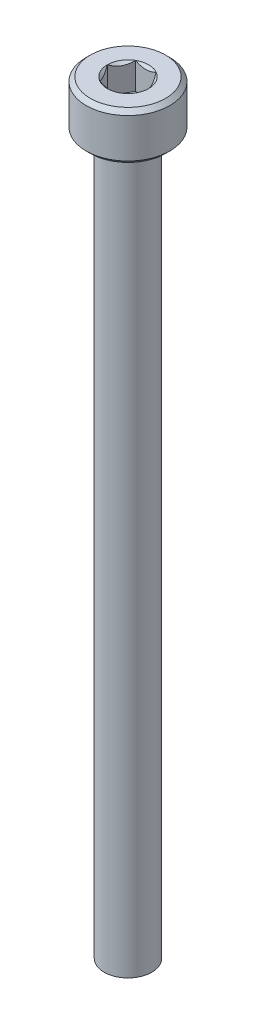
ISO-10303-21;
HEADER;
FILE_DESCRIPTION(('STEP AP214'),'2;1');
FILE_NAME('part.step','',(''),(''),'','','');
FILE_SCHEMA(('AUTOMOTIVE_DESIGN { 1 0 10303 214 1 1 1 1 }'));
ENDSEC;
DATA;
#1=APPLICATION_CONTEXT('core data for automotive mechanical design processes');
#2=APPLICATION_PROTOCOL_DEFINITION('international standard','automotive_design',2000,#1);
#3=PRODUCT_CONTEXT('',#1,'mechanical');
#4=PRODUCT('Part','Part','',(#3));
#5=PRODUCT_RELATED_PRODUCT_CATEGORY('part','',(#4));
#6=PRODUCT_DEFINITION_FORMATION('','',#4);
#7=PRODUCT_DEFINITION_CONTEXT('part definition',#1,'design');
#8=PRODUCT_DEFINITION('design','',#6,#7);
#9=PRODUCT_DEFINITION_SHAPE('','',#8);
#10=(LENGTH_UNIT() NAMED_UNIT(*) SI_UNIT(.MILLI.,.METRE.));
#11=(NAMED_UNIT(*) PLANE_ANGLE_UNIT() SI_UNIT($,.RADIAN.));
#12=(NAMED_UNIT(*) SI_UNIT($,.STERADIAN.) SOLID_ANGLE_UNIT());
#13=UNCERTAINTY_MEASURE_WITH_UNIT(LENGTH_MEASURE(1.E-05),#10,'distance_accuracy_value','');
#14=(GEOMETRIC_REPRESENTATION_CONTEXT(3) GLOBAL_UNCERTAINTY_ASSIGNED_CONTEXT((#13)) GLOBAL_UNIT_ASSIGNED_CONTEXT((#10,
#11,#12)) REPRESENTATION_CONTEXT('',''));
#15=CARTESIAN_POINT('',(0.,0.,0.));
#16=DIRECTION('',(0.,0.,1.));
#17=DIRECTION('',(1.,0.,0.));
#18=AXIS2_PLACEMENT_3D('',#15,#16,#17);
#19=CARTESIAN_POINT('',(0.,4.,0.));
#20=DIRECTION('',(0.,-1.,0.));
#21=DIRECTION('',(0.,0.,-1.));
#22=AXIS2_PLACEMENT_3D('',#19,#20,#21);
#23=CYLINDRICAL_SURFACE('',#22,3.5);
#24=CARTESIAN_POINT('',(0.,0.350000000000001,0.));
#25=DIRECTION('',(0.,1.,0.));
#26=DIRECTION('',(0.,0.,1.));
#27=AXIS2_PLACEMENT_3D('',#24,#25,#26);
#28=CIRCLE('',#27,3.5);
#29=CARTESIAN_POINT('',(0.,0.350000000000001,3.5));
#30=VERTEX_POINT('',#29);
#31=EDGE_CURVE('E222',#30,#30,#28,.T.);
#32=ORIENTED_EDGE('',*,*,#31,.T.);
#33=EDGE_LOOP('',(#32));
#34=FACE_BOUND('',#33,.T.);
#35=CARTESIAN_POINT('',(0.,3.65,0.));
#36=DIRECTION('',(0.,1.,0.));
#37=DIRECTION('',(0.,0.,1.));
#38=AXIS2_PLACEMENT_3D('',#35,#36,#37);
#39=CIRCLE('',#38,3.5);
#40=CARTESIAN_POINT('',(0.,3.65,3.5));
#41=VERTEX_POINT('',#40);
#42=EDGE_CURVE('E105',#41,#41,#39,.F.);
#43=ORIENTED_EDGE('',*,*,#42,.T.);
#44=EDGE_LOOP('',(#43));
#45=FACE_BOUND('',#44,.T.);
#46=ADVANCED_FACE('F33',(#34,#45),#23,.T.);
#47=CARTESIAN_POINT('',(0.,4.,0.));
#48=DIRECTION('',(0.,1.,0.));
#49=DIRECTION('',(0.,0.,1.));
#50=AXIS2_PLACEMENT_3D('',#47,#48,#49);
#51=PLANE('',#50);
#52=CARTESIAN_POINT('',(0.,4.,0.));
#53=DIRECTION('',(0.,1.,0.));
#54=DIRECTION('',(0.,0.,1.));
#55=AXIS2_PLACEMENT_3D('',#52,#53,#54);
#56=CIRCLE('',#55,3.15);
#57=CARTESIAN_POINT('',(0.,4.,3.15));
#58=VERTEX_POINT('',#57);
#59=EDGE_CURVE('E37',#58,#58,#56,.T.);
#60=ORIENTED_EDGE('',*,*,#59,.T.);
#61=EDGE_LOOP('',(#60));
#62=FACE_BOUND('',#61,.T.);
#63=CARTESIAN_POINT('',(0.,4.,0.));
#64=DIRECTION('',(0.,1.,0.));
#65=DIRECTION('',(0.,0.,1.));
#66=AXIS2_PLACEMENT_3D('',#63,#64,#65);
#67=CIRCLE('',#66,1.73205080756888);
#68=CARTESIAN_POINT('',(0.866025403784438,4.,1.5));
#69=VERTEX_POINT('',#68);
#70=CARTESIAN_POINT('',(1.73205080756888,4.,0.));
#71=VERTEX_POINT('',#70);
#72=EDGE_CURVE('E48',#69,#71,#67,.T.);
#73=ORIENTED_EDGE('',*,*,#72,.F.);
#74=CARTESIAN_POINT('',(-0.866025403784438,4.,1.5));
#75=VERTEX_POINT('',#74);
#76=EDGE_CURVE('E55',#75,#69,#67,.T.);
#77=ORIENTED_EDGE('',*,*,#76,.F.);
#78=CARTESIAN_POINT('',(-1.73205080756888,4.,0.));
#79=VERTEX_POINT('',#78);
#80=EDGE_CURVE('E128',#79,#75,#67,.T.);
#81=ORIENTED_EDGE('',*,*,#80,.F.);
#82=CARTESIAN_POINT('',(-0.866025403784439,4.,-1.5));
#83=VERTEX_POINT('',#82);
#84=EDGE_CURVE('E127',#83,#79,#67,.T.);
#85=ORIENTED_EDGE('',*,*,#84,.F.);
#86=CARTESIAN_POINT('',(0.866025403784438,4.,-1.5));
#87=VERTEX_POINT('',#86);
#88=EDGE_CURVE('E95',#87,#83,#67,.T.);
#89=ORIENTED_EDGE('',*,*,#88,.F.);
#90=EDGE_CURVE('E87',#71,#87,#67,.T.);
#91=ORIENTED_EDGE('',*,*,#90,.F.);
#92=EDGE_LOOP('',(#73,#77,#81,#85,#89,#91));
#93=FACE_BOUND('',#92,.T.);
#94=ADVANCED_FACE('F125',(#62,#93),#51,.T.);
#95=CARTESIAN_POINT('',(0.,0.,0.));
#96=DIRECTION('',(0.,1.,0.));
#97=DIRECTION('',(0.,0.,1.));
#98=AXIS2_PLACEMENT_3D('',#95,#96,#97);
#99=PLANE('',#98);
#100=CARTESIAN_POINT('',(0.,0.,0.));
#101=DIRECTION('',(0.,-1.,0.));
#102=DIRECTION('',(0.,0.,-1.));
#103=AXIS2_PLACEMENT_3D('',#100,#101,#102);
#104=CIRCLE('',#103,2.);
#105=CARTESIAN_POINT('',(0.,0.,-2.));
#106=VERTEX_POINT('',#105);
#107=EDGE_CURVE('E11',#106,#106,#104,.T.);
#108=ORIENTED_EDGE('',*,*,#107,.F.);
#109=EDGE_LOOP('',(#108));
#110=FACE_BOUND('',#109,.T.);
#111=CARTESIAN_POINT('',(0.,0.,0.));
#112=DIRECTION('',(0.,1.,0.));
#113=DIRECTION('',(0.,0.,1.));
#114=AXIS2_PLACEMENT_3D('',#111,#112,#113);
#115=CIRCLE('',#114,3.15);
#116=CARTESIAN_POINT('',(0.,0.,3.15));
#117=VERTEX_POINT('',#116);
#118=EDGE_CURVE('E220',#117,#117,#115,.F.);
#119=ORIENTED_EDGE('',*,*,#118,.T.);
#120=EDGE_LOOP('',(#119));
#121=FACE_BOUND('',#120,.T.);
#122=ADVANCED_FACE('F203',(#110,#121),#99,.F.);
#123=CARTESIAN_POINT('',(0.,4.,0.));
#124=DIRECTION('',(0.,1.,0.));
#125=DIRECTION('',(0.,0.,1.));
#126=AXIS2_PLACEMENT_3D('',#123,#124,#125);
#127=CONICAL_SURFACE('',#126,1.73205080756888,0.78539816339745);
#128=ORIENTED_EDGE('',*,*,#88,.T.);
#129=CARTESIAN_POINT('',(-1.72720812969692,4.55557851627079,-1.5));
#130=CARTESIAN_POINT('',(-1.68515175699268,4.52382990785743,-1.5));
#131=CARTESIAN_POINT('',(-1.64286104748673,4.49239259380738,-1.5));
#132=CARTESIAN_POINT('',(-1.55771581035942,4.43026908755641,-1.5));
#133=CARTESIAN_POINT('',(-1.51486114386668,4.3995830858922,-1.5));
#134=CARTESIAN_POINT('',(-1.3846813415127,4.30840719242716,-1.5));
#135=CARTESIAN_POINT('',(-1.29637976071654,4.24928834342677,-1.5));
#136=CARTESIAN_POINT('',(-1.11121478730467,4.1332309963165,-1.5));
#137=CARTESIAN_POINT('',(-1.01415038238167,4.07660955873301,-1.5));
#138=CARTESIAN_POINT('',(-0.815173408897606,3.97303688126565,-1.5));
#139=CARTESIAN_POINT('',(-0.713278669253285,3.92605304154167,-1.5));
#140=CARTESIAN_POINT('',(-0.560333774943112,3.86857266843083,-1.5));
#141=CARTESIAN_POINT('',(-0.511547982948042,3.85207538775725,-1.5));
#142=CARTESIAN_POINT('',(-0.412798620136866,3.822997512927,-1.5));
#143=CARTESIAN_POINT('',(-0.362834968437563,3.81041718859402,-1.5));
#144=CARTESIAN_POINT('',(-0.262863235444982,3.79003619414677,-1.5));
#145=CARTESIAN_POINT('',(-0.212872113808023,3.78215363274598,-1.5));
#146=CARTESIAN_POINT('',(-0.112355243569545,3.771322063969,-1.5));
#147=CARTESIAN_POINT('',(-0.0618295883726279,3.76837220852435,-1.5));
#148=CARTESIAN_POINT('',(0.037429173332384,3.76762485772485,-1.5));
#149=CARTESIAN_POINT('',(0.0861609672002989,3.76964473355808,-1.5));
#150=CARTESIAN_POINT('',(0.183206937768827,3.77832255289676,-1.5));
#151=CARTESIAN_POINT('',(0.231521073438269,3.78498094696846,-1.5));
#152=CARTESIAN_POINT('',(0.328199853425436,3.80268524412257,-1.5));
#153=CARTESIAN_POINT('',(0.376550616310328,3.81380581125704,-1.5));
#154=CARTESIAN_POINT('',(0.472195697125598,3.83984341404871,-1.5));
#155=CARTESIAN_POINT('',(0.51949010309274,3.85476013204094,-1.5));
#156=CARTESIAN_POINT('',(0.668391282696624,3.90733522359607,-1.5));
#157=CARTESIAN_POINT('',(0.767878709508552,3.95098128747198,-1.5));
#158=CARTESIAN_POINT('',(0.962179866690724,4.0480229945931,-1.5));
#159=CARTESIAN_POINT('',(1.05697519961444,4.10145366508953,-1.5));
#160=CARTESIAN_POINT('',(1.23814273533383,4.21168585200456,-1.5));
#161=CARTESIAN_POINT('',(1.3246994218129,4.2681879206986,-1.5));
#162=CARTESIAN_POINT('',(1.45222331290673,4.35553430157866,-1.5));
#163=CARTESIAN_POINT('',(1.49418091978756,4.38495775868004,-1.5));
#164=CARTESIAN_POINT('',(1.57752272931476,4.44458282183046,-1.5));
#165=CARTESIAN_POINT('',(1.61890708647354,4.47478421166444,-1.5));
#166=CARTESIAN_POINT('',(1.66005278019494,4.50530817860946,-1.5));
#167=B_SPLINE_CURVE_WITH_KNOTS('',3,(#129,#130,#131,#132,#133,#134,#135,#136,#137,#138,#139,
#140,#141,#142,#143,#144,#145,#146,#147,#148,#149,#150,#151,#152,#153,#154,#155,#156,#157,#158,
#159,#160,#161,#162,#163,#164,#165,#166),.UNSPECIFIED.,.F.,.F.,(4,2,2,2,2,2,2,2,2,2,2,2,2,2,2,2,
2,2,4),(0.,0.158079548982669,0.316198780993942,0.634850417346958,0.971690311361509,
1.30737131660667,1.46173961127089,1.61611853740677,1.76772101421409,1.91929742368538,
2.065387412096,2.21149159305544,2.36014984633872,2.50879566386709,2.83376031422673,
3.15991186985652,3.46985601802197,3.62358896039974,3.7772796264207),.UNSPECIFIED.);
#168=EDGE_CURVE('E100',#87,#83,#167,.F.);
#169=ORIENTED_EDGE('',*,*,#168,.F.);
#170=EDGE_LOOP('',(#128,#169));
#171=FACE_BOUND('',#170,.T.);
#172=ADVANCED_FACE('F101',(#171),#127,.F.);
#173=ORIENTED_EDGE('',*,*,#84,.T.);
#174=CARTESIAN_POINT('',(-0.865909933730601,4.00011548160007,-1.5002));
#175=CARTESIAN_POINT('',(-0.895682611594166,3.97036547606733,-1.44863220926292));
#176=CARTESIAN_POINT('',(-0.925953159489765,3.94236248391031,-1.3962020823348));
#177=CARTESIAN_POINT('',(-0.987678321317123,3.89108923044014,-1.2892909659444));
#178=CARTESIAN_POINT('',(-1.01913880822717,3.86784750504437,-1.23479980418534));
#179=CARTESIAN_POINT('',(-1.08257741237344,3.82803372899222,-1.12492091864275));
#180=CARTESIAN_POINT('',(-1.11453936608521,3.8113615856709,-1.0695611909048));
#181=CARTESIAN_POINT('',(-1.1791670593912,3.7856744568181,-0.957622742522849));
#182=CARTESIAN_POINT('',(-1.21183082354213,3.77664029047887,-0.901047443446992));
#183=CARTESIAN_POINT('',(-1.26812411040032,3.76848908122685,-0.803544610483559));
#184=CARTESIAN_POINT('',(-1.29168087824208,3.76728225298922,-0.762743091719534));
#185=CARTESIAN_POINT('',(-1.33875285845138,3.76931405716227,-0.681212030384142));
#186=CARTESIAN_POINT('',(-1.36226806050018,3.77255367074831,-0.64048250568537));
#187=CARTESIAN_POINT('',(-1.40907206156905,3.78329198598196,-0.559415597836584));
#188=CARTESIAN_POINT('',(-1.43236062923612,3.79079465301873,-0.519078615401712));
#189=CARTESIAN_POINT('',(-1.47854689118996,3.80965161192829,-0.439081663085969));
#190=CARTESIAN_POINT('',(-1.50144441326545,3.82100755701858,-0.399421991483792));
#191=CARTESIAN_POINT('',(-1.56009461325633,3.85472164759267,-0.297836865225515));
#192=CARTESIAN_POINT('',(-1.59548353987866,3.87962184909337,-0.236541446290311));
#193=CARTESIAN_POINT('',(-1.64751843074894,3.92165665327158,-0.146414371536686));
#194=CARTESIAN_POINT('',(-1.66466545167617,3.9364251535591,-0.116714860092282));
#195=CARTESIAN_POINT('',(-1.69864410935691,3.96731056594017,-0.0578620986162487));
#196=CARTESIAN_POINT('',(-1.71547589206761,3.98342683412171,-0.0287085957793624));
#197=CARTESIAN_POINT('',(-1.73216627762272,4.00011548160007,0.00020000000000028));
#198=B_SPLINE_CURVE_WITH_KNOTS('',3,(#174,#175,#176,#177,#178,#179,#180,#181,#182,#183,#184,
#185,#186,#187,#188,#189,#190,#191,#192,#193,#194,#195,#196,#197),.UNSPECIFIED.,.F.,.F.,(4,2,2,
2,2,2,2,2,2,2,2,4),(0.,0.199829143693304,0.400822987382388,0.598623720538181,0.795926240188889,
0.937113067959881,1.07833105577193,1.21968061668222,1.36109089931054,1.58570969637565,
1.69770705470964,1.80965120737194),.UNSPECIFIED.);
#199=EDGE_CURVE('E130',#83,#79,#198,.T.);
#200=ORIENTED_EDGE('',*,*,#199,.F.);
#201=EDGE_LOOP('',(#173,#200));
#202=FACE_BOUND('',#201,.T.);
#203=ADVANCED_FACE('F237',(#202),#127,.F.);
#204=ORIENTED_EDGE('',*,*,#80,.T.);
#205=CARTESIAN_POINT('',(-1.73216627762272,4.00011548160007,-0.000199999999999694));
#206=CARTESIAN_POINT('',(-1.70239359975915,3.97036547606733,0.051367790737076));
#207=CARTESIAN_POINT('',(-1.67212305186355,3.94236248391031,0.103797917665201));
#208=CARTESIAN_POINT('',(-1.61039789003619,3.89108923044014,0.210709034055597));
#209=CARTESIAN_POINT('',(-1.57893740312614,3.86784750504437,0.265200195814662));
#210=CARTESIAN_POINT('',(-1.51549879897987,3.82803372899222,0.375079081357249));
#211=CARTESIAN_POINT('',(-1.4835368452681,3.8113615856709,0.4304388090952));
#212=CARTESIAN_POINT('',(-1.41890915196211,3.7856744568181,0.542377257477151));
#213=CARTESIAN_POINT('',(-1.38624538781118,3.77664029047887,0.598952556553009));
#214=CARTESIAN_POINT('',(-1.32995210095299,3.76848908122685,0.696455389516441));
#215=CARTESIAN_POINT('',(-1.30639533311124,3.76728225298922,0.737256908280466));
#216=CARTESIAN_POINT('',(-1.25932335290193,3.76931405716227,0.818787969615858));
#217=CARTESIAN_POINT('',(-1.23580815085313,3.77255367074831,0.85951749431463));
#218=CARTESIAN_POINT('',(-1.18900414978427,3.78329198598196,0.940584402163416));
#219=CARTESIAN_POINT('',(-1.1657155821172,3.79079465301873,0.980921384598288));
#220=CARTESIAN_POINT('',(-1.11952932016335,3.80965161192829,1.06091833691403));
#221=CARTESIAN_POINT('',(-1.09663179808786,3.82100755701859,1.10057800851621));
#222=CARTESIAN_POINT('',(-1.03798159809698,3.85472164759267,1.20216313477448));
#223=CARTESIAN_POINT('',(-1.00259267147465,3.87962184909337,1.26345855370969));
#224=CARTESIAN_POINT('',(-0.950557780604375,3.92165665327158,1.35358562846331));
#225=CARTESIAN_POINT('',(-0.933410759677147,3.9364251535591,1.38328513990772));
#226=CARTESIAN_POINT('',(-0.899432101996407,3.96731056594017,1.44213790138375));
#227=CARTESIAN_POINT('',(-0.88260031928571,3.98342683412171,1.47129140422064));
#228=CARTESIAN_POINT('',(-0.865909933730601,4.00011548160007,1.5002));
#229=B_SPLINE_CURVE_WITH_KNOTS('',3,(#205,#206,#207,#208,#209,#210,#211,#212,#213,#214,#215,
#216,#217,#218,#219,#220,#221,#222,#223,#224,#225,#226,#227,#228),.UNSPECIFIED.,.F.,.F.,(4,2,2,
2,2,2,2,2,2,2,2,4),(0.,0.199829143693305,0.400822987382389,0.598623720538181,0.795926240188889,
0.937113067959881,1.07833105577193,1.21968061668222,1.36109089931054,1.58570969637565,
1.69770705470964,1.80965120737194),.UNSPECIFIED.);
#230=EDGE_CURVE('E139',#79,#75,#229,.T.);
#231=ORIENTED_EDGE('',*,*,#230,.F.);
#232=EDGE_LOOP('',(#204,#231));
#233=FACE_BOUND('',#232,.T.);
#234=ADVANCED_FACE('F252',(#233),#127,.F.);
#235=ORIENTED_EDGE('',*,*,#76,.T.);
#236=CARTESIAN_POINT('',(-1.72720812994822,4.55557851646053,1.5));
#237=CARTESIAN_POINT('',(-1.68515175723693,4.52382990803985,1.5));
#238=CARTESIAN_POINT('',(-1.64286104772391,4.49239259398251,1.5));
#239=CARTESIAN_POINT('',(-1.55771581058238,4.43026908771699,1.5));
#240=CARTESIAN_POINT('',(-1.51486114408249,4.39958308604553,1.5));
#241=CARTESIAN_POINT('',(-1.38468134170665,4.30840719255859,1.5));
#242=CARTESIAN_POINT('',(-1.29637976089561,4.24928834354366,1.5));
#243=CARTESIAN_POINT('',(-1.11121478745132,4.13323099640349,1.5));
#244=CARTESIAN_POINT('',(-1.01415038251067,4.07660955880473,1.5));
#245=CARTESIAN_POINT('',(-0.815173408989814,3.9730368813091,1.5));
#246=CARTESIAN_POINT('',(-0.71327866932636,3.92605304157206,1.5));
#247=CARTESIAN_POINT('',(-0.56033377500179,3.86857266845154,1.5));
#248=CARTESIAN_POINT('',(-0.511547983012749,3.85207538777834,1.5));
#249=CARTESIAN_POINT('',(-0.412798620213828,3.82299751294763,1.5));
#250=CARTESIAN_POINT('',(-0.362834968520751,3.8104171886138,1.5));
#251=CARTESIAN_POINT('',(-0.262863235540417,3.79003619416346,1.5));
#252=CARTESIAN_POINT('',(-0.212872113909475,3.78215363276045,1.5));
#253=CARTESIAN_POINT('',(-0.112355243682832,3.77132206397768,1.5));
#254=CARTESIAN_POINT('',(-0.061829588491731,3.76837220852945,1.5));
#255=CARTESIAN_POINT('',(0.0374291732025493,3.76762485772178,1.5));
#256=CARTESIAN_POINT('',(0.086160967065534,3.76964473355048,1.5));
#257=CARTESIAN_POINT('',(0.183206937624695,3.77832255287941,1.5));
#258=CARTESIAN_POINT('',(0.2315210732897,3.78498094694588,1.5));
#259=CARTESIAN_POINT('',(0.328199853268108,3.80268524408904,1.5));
#260=CARTESIAN_POINT('',(0.376550616148692,3.81380581121775,1.5));
#261=CARTESIAN_POINT('',(0.47219569695576,3.83984341399777,1.5));
#262=CARTESIAN_POINT('',(0.51949010291901,3.8547601319841,1.5));
#263=CARTESIAN_POINT('',(0.668391282485064,3.90733522351148,1.5));
#264=CARTESIAN_POINT('',(0.767878709264951,3.95098128736184,1.5));
#265=CARTESIAN_POINT('',(0.9621798663855,4.04802299442906,1.5));
#266=CARTESIAN_POINT('',(1.05697519927965,4.10145366489712,1.5));
#267=CARTESIAN_POINT('',(1.23814273494588,4.21168585175783,1.5));
#268=CARTESIAN_POINT('',(1.32469942140117,4.26818792042618,1.5));
#269=CARTESIAN_POINT('',(1.45222331245985,4.35553430126784,1.5));
#270=CARTESIAN_POINT('',(1.49418091932912,4.38495775835653,1.5));
#271=CARTESIAN_POINT('',(1.5775227288333,4.44458282148157,1.5));
#272=CARTESIAN_POINT('',(1.6189070859806,4.47478421130286,1.5));
#273=CARTESIAN_POINT('',(1.66005277969054,4.50530817823521,1.5));
#274=B_SPLINE_CURVE_WITH_KNOTS('',3,(#236,#237,#238,#239,#240,#241,#242,#243,#244,#245,#246,
#247,#248,#249,#250,#251,#252,#253,#254,#255,#256,#257,#258,#259,#260,#261,#262,#263,#264,#265,
#266,#267,#268,#269,#270,#271,#272,#273),.UNSPECIFIED.,.F.,.F.,(4,2,2,2,2,2,2,2,2,2,2,2,2,2,2,2,
2,2,4),(0.,0.158079549012757,0.316198781054129,0.634850417468465,0.971690311551782,
1.30737131686505,1.46173961151184,1.61611853763032,1.76772101442095,1.91929742387554,
2.06538741227089,2.21149159321503,2.36014984648185,2.50879566399376,2.83376031423511,
3.15991186974582,3.4698560178094,3.62358896013692,3.77727962610764),.UNSPECIFIED.);
#275=EDGE_CURVE('E166',#75,#69,#274,.T.);
#276=ORIENTED_EDGE('',*,*,#275,.F.);
#277=EDGE_LOOP('',(#235,#276));
#278=FACE_BOUND('',#277,.T.);
#279=ADVANCED_FACE('F282',(#278),#127,.F.);
#280=ORIENTED_EDGE('',*,*,#72,.T.);
#281=CARTESIAN_POINT('',(0.865909933730601,4.00011548160007,1.5002));
#282=CARTESIAN_POINT('',(0.895682611594166,3.97036547606733,1.44863220926292));
#283=CARTESIAN_POINT('',(0.925953159489765,3.94236248391031,1.3962020823348));
#284=CARTESIAN_POINT('',(0.987678321317124,3.89108923044014,1.2892909659444));
#285=CARTESIAN_POINT('',(1.01913880822717,3.86784750504437,1.23479980418534));
#286=CARTESIAN_POINT('',(1.08257741237344,3.82803372899222,1.12492091864275));
#287=CARTESIAN_POINT('',(1.11453936608521,3.8113615856709,1.0695611909048));
#288=CARTESIAN_POINT('',(1.1791670593912,3.7856744568181,0.95762274252285));
#289=CARTESIAN_POINT('',(1.21183082354213,3.77664029047887,0.901047443446992));
#290=CARTESIAN_POINT('',(1.26812411040032,3.76848908122685,0.80354461048356));
#291=CARTESIAN_POINT('',(1.29168087824208,3.76728225298922,0.762743091719534));
#292=CARTESIAN_POINT('',(1.33875285845138,3.76931405716227,0.681212030384142));
#293=CARTESIAN_POINT('',(1.36226806050018,3.77255367074831,0.640482505685371));
#294=CARTESIAN_POINT('',(1.40907206156905,3.78329198598196,0.559415597836584));
#295=CARTESIAN_POINT('',(1.43236062923612,3.79079465301873,0.519078615401712));
#296=CARTESIAN_POINT('',(1.47854689118996,3.80965161192829,0.43908166308597));
#297=CARTESIAN_POINT('',(1.50144441326545,3.82100755701859,0.399421991483792));
#298=CARTESIAN_POINT('',(1.56009461325633,3.85472164759267,0.297836865225515));
#299=CARTESIAN_POINT('',(1.59548353987866,3.87962184909337,0.236541446290311));
#300=CARTESIAN_POINT('',(1.64751843074894,3.92165665327158,0.146414371536686));
#301=CARTESIAN_POINT('',(1.66466545167617,3.9364251535591,0.116714860092282));
#302=CARTESIAN_POINT('',(1.69864410935691,3.96731056594017,0.0578620986162488));
#303=CARTESIAN_POINT('',(1.71547589206761,3.98342683412171,0.0287085957793626));
#304=CARTESIAN_POINT('',(1.73216627762272,4.00011548160007,-0.000200000000000026));
#305=B_SPLINE_CURVE_WITH_KNOTS('',3,(#281,#282,#283,#284,#285,#286,#287,#288,#289,#290,#291,
#292,#293,#294,#295,#296,#297,#298,#299,#300,#301,#302,#303,#304),.UNSPECIFIED.,.F.,.F.,(4,2,2,
2,2,2,2,2,2,2,2,4),(0.,0.199829143693305,0.400822987382389,0.59862372053818,0.795926240188889,
0.937113067959881,1.07833105577193,1.21968061668222,1.36109089931054,1.58570969637565,
1.69770705470964,1.80965120737194),.UNSPECIFIED.);
#306=EDGE_CURVE('E115',#69,#71,#305,.T.);
#307=ORIENTED_EDGE('',*,*,#306,.F.);
#308=EDGE_LOOP('',(#280,#307));
#309=FACE_BOUND('',#308,.T.);
#310=ADVANCED_FACE('F153',(#309),#127,.F.);
#311=ORIENTED_EDGE('',*,*,#90,.T.);
#312=CARTESIAN_POINT('',(1.73216627762272,4.00011548160007,0.000200000000000282));
#313=CARTESIAN_POINT('',(1.70239359975915,3.97036547606733,-0.0513677907370753));
#314=CARTESIAN_POINT('',(1.67212305186355,3.94236248391031,-0.103797917665201));
#315=CARTESIAN_POINT('',(1.61039789003619,3.89108923044014,-0.210709034055596));
#316=CARTESIAN_POINT('',(1.57893740312614,3.86784750504437,-0.265200195814661));
#317=CARTESIAN_POINT('',(1.51549879897987,3.82803372899222,-0.375079081357248));
#318=CARTESIAN_POINT('',(1.4835368452681,3.8113615856709,-0.430438809095199));
#319=CARTESIAN_POINT('',(1.41890915196211,3.7856744568181,-0.54237725747715));
#320=CARTESIAN_POINT('',(1.38624538781118,3.77664029047887,-0.598952556553008));
#321=CARTESIAN_POINT('',(1.32995210095299,3.76848908122685,-0.69645538951644));
#322=CARTESIAN_POINT('',(1.30639533311124,3.76728225298922,-0.737256908280466));
#323=CARTESIAN_POINT('',(1.25932335290193,3.76931405716227,-0.818787969615858));
#324=CARTESIAN_POINT('',(1.23580815085313,3.77255367074831,-0.85951749431463));
#325=CARTESIAN_POINT('',(1.18900414978427,3.78329198598196,-0.940584402163416));
#326=CARTESIAN_POINT('',(1.1657155821172,3.79079465301873,-0.980921384598288));
#327=CARTESIAN_POINT('',(1.11952932016335,3.80965161192829,-1.06091833691403));
#328=CARTESIAN_POINT('',(1.09663179808786,3.82100755701858,-1.10057800851621));
#329=CARTESIAN_POINT('',(1.03798159809698,3.85472164759267,-1.20216313477448));
#330=CARTESIAN_POINT('',(1.00259267147465,3.87962184909337,-1.26345855370969));
#331=CARTESIAN_POINT('',(0.950557780604375,3.92165665327158,-1.35358562846331));
#332=CARTESIAN_POINT('',(0.933410759677148,3.9364251535591,-1.38328513990772));
#333=CARTESIAN_POINT('',(0.899432101996407,3.96731056594017,-1.44213790138375));
#334=CARTESIAN_POINT('',(0.88260031928571,3.98342683412171,-1.47129140422064));
#335=CARTESIAN_POINT('',(0.865909933730601,4.00011548160007,-1.5002));
#336=B_SPLINE_CURVE_WITH_KNOTS('',3,(#312,#313,#314,#315,#316,#317,#318,#319,#320,#321,#322,
#323,#324,#325,#326,#327,#328,#329,#330,#331,#332,#333,#334,#335),.UNSPECIFIED.,.F.,.F.,(4,2,2,
2,2,2,2,2,2,2,2,4),(0.,0.199829143693305,0.400822987382389,0.598623720538181,0.79592624018889,
0.937113067959881,1.07833105577193,1.21968061668222,1.36109089931054,1.58570969637566,
1.69770705470964,1.80965120737194),.UNSPECIFIED.);
#337=EDGE_CURVE('E91',#71,#87,#336,.T.);
#338=ORIENTED_EDGE('',*,*,#337,.F.);
#339=EDGE_LOOP('',(#311,#338));
#340=FACE_BOUND('',#339,.T.);
#341=ADVANCED_FACE('F89',(#340),#127,.F.);
#342=CARTESIAN_POINT('',(0.,1.75,0.));
#343=DIRECTION('',(0.,1.,0.));
#344=DIRECTION('',(0.,0.,1.));
#345=AXIS2_PLACEMENT_3D('',#342,#343,#344);
#346=PLANE('',#345);
#347=DIRECTION('',(-0.5,0.,-0.866025403784439));
#348=VECTOR('',#347,1.);
#349=CARTESIAN_POINT('',(1.73205080756888,1.75,0.));
#350=LINE('',#349,#348);
#351=CARTESIAN_POINT('',(1.73205080756888,1.75,0.));
#352=VERTEX_POINT('',#351);
#353=CARTESIAN_POINT('',(0.866025403784438,1.75,-1.5));
#354=VERTEX_POINT('',#353);
#355=EDGE_CURVE('E114',#352,#354,#350,.T.);
#356=ORIENTED_EDGE('',*,*,#355,.T.);
#357=DIRECTION('',(-1.,0.,0.));
#358=VECTOR('',#357,1.);
#359=CARTESIAN_POINT('',(0.866025403784438,1.75,-1.5));
#360=LINE('',#359,#358);
#361=CARTESIAN_POINT('',(-0.866025403784439,1.75,-1.5));
#362=VERTEX_POINT('',#361);
#363=EDGE_CURVE('E119',#354,#362,#360,.T.);
#364=ORIENTED_EDGE('',*,*,#363,.T.);
#365=DIRECTION('',(-0.5,0.,0.866025403784439));
#366=VECTOR('',#365,1.);
#367=CARTESIAN_POINT('',(-0.866025403784439,1.75,-1.5));
#368=LINE('',#367,#366);
#369=CARTESIAN_POINT('',(-1.73205080756888,1.75,0.));
#370=VERTEX_POINT('',#369);
#371=EDGE_CURVE('E276',#362,#370,#368,.T.);
#372=ORIENTED_EDGE('',*,*,#371,.T.);
#373=DIRECTION('',(0.5,0.,0.866025403784439));
#374=VECTOR('',#373,1.);
#375=CARTESIAN_POINT('',(-1.73205080756888,1.75,0.));
#376=LINE('',#375,#374);
#377=CARTESIAN_POINT('',(-0.866025403784438,1.75,1.5));
#378=VERTEX_POINT('',#377);
#379=EDGE_CURVE('E259',#370,#378,#376,.T.);
#380=ORIENTED_EDGE('',*,*,#379,.T.);
#381=DIRECTION('',(1.,0.,0.));
#382=VECTOR('',#381,1.);
#383=CARTESIAN_POINT('',(-0.866025403784438,1.75,1.5));
#384=LINE('',#383,#382);
#385=CARTESIAN_POINT('',(0.866025403784439,1.75,1.5));
#386=VERTEX_POINT('',#385);
#387=EDGE_CURVE('E272',#378,#386,#384,.T.);
#388=ORIENTED_EDGE('',*,*,#387,.T.);
#389=DIRECTION('',(0.5,0.,-0.866025403784439));
#390=VECTOR('',#389,1.);
#391=CARTESIAN_POINT('',(0.866025403784439,1.75,1.5));
#392=LINE('',#391,#390);
#393=EDGE_CURVE('E122',#386,#352,#392,.T.);
#394=ORIENTED_EDGE('',*,*,#393,.T.);
#395=EDGE_LOOP('',(#356,#364,#372,#380,#388,#394));
#396=FACE_BOUND('',#395,.T.);
#397=ADVANCED_FACE('F152',(#396),#346,.T.);
#398=CARTESIAN_POINT('',(0.866025403784438,1.75,-1.5));
#399=DIRECTION('',(0.,0.,-1.));
#400=DIRECTION('',(-1.,0.,0.));
#401=AXIS2_PLACEMENT_3D('',#398,#399,#400);
#402=PLANE('',#401);
#403=DIRECTION('',(0.,1.,0.));
#404=VECTOR('',#403,1.);
#405=CARTESIAN_POINT('',(0.866025403784438,1.75,-1.5));
#406=LINE('',#405,#404);
#407=EDGE_CURVE('E112',#354,#87,#406,.T.);
#408=ORIENTED_EDGE('',*,*,#407,.T.);
#409=ORIENTED_EDGE('',*,*,#168,.T.);
#410=DIRECTION('',(0.,1.,0.));
#411=VECTOR('',#410,1.);
#412=CARTESIAN_POINT('',(-0.866025403784439,1.75,-1.5));
#413=LINE('',#412,#411);
#414=EDGE_CURVE('E121',#362,#83,#413,.T.);
#415=ORIENTED_EDGE('',*,*,#414,.F.);
#416=ORIENTED_EDGE('',*,*,#363,.F.);
#417=EDGE_LOOP('',(#408,#409,#415,#416));
#418=FACE_BOUND('',#417,.T.);
#419=ADVANCED_FACE('F117',(#418),#402,.F.);
#420=CARTESIAN_POINT('',(-0.866025403784439,1.75,-1.5));
#421=DIRECTION('',(-0.866025403784439,0.,-0.5));
#422=DIRECTION('',(-0.5,0.,0.866025403784439));
#423=AXIS2_PLACEMENT_3D('',#420,#421,#422);
#424=PLANE('',#423);
#425=ORIENTED_EDGE('',*,*,#414,.T.);
#426=ORIENTED_EDGE('',*,*,#199,.T.);
#427=DIRECTION('',(0.,1.,0.));
#428=VECTOR('',#427,1.);
#429=CARTESIAN_POINT('',(-1.73205080756888,1.75,0.));
#430=LINE('',#429,#428);
#431=EDGE_CURVE('E255',#370,#79,#430,.T.);
#432=ORIENTED_EDGE('',*,*,#431,.F.);
#433=ORIENTED_EDGE('',*,*,#371,.F.);
#434=EDGE_LOOP('',(#425,#426,#432,#433));
#435=FACE_BOUND('',#434,.T.);
#436=ADVANCED_FACE('F145',(#435),#424,.F.);
#437=CARTESIAN_POINT('',(-1.73205080756888,1.75,0.));
#438=DIRECTION('',(-0.866025403784439,0.,0.5));
#439=DIRECTION('',(0.5,0.,0.866025403784439));
#440=AXIS2_PLACEMENT_3D('',#437,#438,#439);
#441=PLANE('',#440);
#442=ORIENTED_EDGE('',*,*,#431,.T.);
#443=ORIENTED_EDGE('',*,*,#230,.T.);
#444=DIRECTION('',(0.,1.,0.));
#445=VECTOR('',#444,1.);
#446=CARTESIAN_POINT('',(-0.866025403784438,1.75,1.5));
#447=LINE('',#446,#445);
#448=EDGE_CURVE('E261',#378,#75,#447,.T.);
#449=ORIENTED_EDGE('',*,*,#448,.F.);
#450=ORIENTED_EDGE('',*,*,#379,.F.);
#451=EDGE_LOOP('',(#442,#443,#449,#450));
#452=FACE_BOUND('',#451,.T.);
#453=ADVANCED_FACE('F187',(#452),#441,.F.);
#454=CARTESIAN_POINT('',(-0.866025403784438,1.75,1.5));
#455=DIRECTION('',(0.,0.,1.));
#456=DIRECTION('',(1.,0.,0.));
#457=AXIS2_PLACEMENT_3D('',#454,#455,#456);
#458=PLANE('',#457);
#459=ORIENTED_EDGE('',*,*,#448,.T.);
#460=ORIENTED_EDGE('',*,*,#275,.T.);
#461=DIRECTION('',(0.,1.,0.));
#462=VECTOR('',#461,1.);
#463=CARTESIAN_POINT('',(0.866025403784439,1.75,1.5));
#464=LINE('',#463,#462);
#465=EDGE_CURVE('E263',#386,#69,#464,.T.);
#466=ORIENTED_EDGE('',*,*,#465,.F.);
#467=ORIENTED_EDGE('',*,*,#387,.F.);
#468=EDGE_LOOP('',(#459,#460,#466,#467));
#469=FACE_BOUND('',#468,.T.);
#470=ADVANCED_FACE('F183',(#469),#458,.F.);
#471=CARTESIAN_POINT('',(0.866025403784439,1.75,1.5));
#472=DIRECTION('',(0.866025403784439,0.,0.5));
#473=DIRECTION('',(0.5,0.,-0.866025403784439));
#474=AXIS2_PLACEMENT_3D('',#471,#472,#473);
#475=PLANE('',#474);
#476=ORIENTED_EDGE('',*,*,#465,.T.);
#477=ORIENTED_EDGE('',*,*,#306,.T.);
#478=DIRECTION('',(0.,1.,0.));
#479=VECTOR('',#478,1.);
#480=CARTESIAN_POINT('',(1.73205080756888,1.75,0.));
#481=LINE('',#480,#479);
#482=EDGE_CURVE('E106',#352,#71,#481,.T.);
#483=ORIENTED_EDGE('',*,*,#482,.F.);
#484=ORIENTED_EDGE('',*,*,#393,.F.);
#485=EDGE_LOOP('',(#476,#477,#483,#484));
#486=FACE_BOUND('',#485,.T.);
#487=ADVANCED_FACE('F180',(#486),#475,.F.);
#488=CARTESIAN_POINT('',(1.73205080756888,1.75,0.));
#489=DIRECTION('',(0.866025403784439,0.,-0.5));
#490=DIRECTION('',(-0.5,0.,-0.866025403784439));
#491=AXIS2_PLACEMENT_3D('',#488,#489,#490);
#492=PLANE('',#491);
#493=ORIENTED_EDGE('',*,*,#482,.T.);
#494=ORIENTED_EDGE('',*,*,#337,.T.);
#495=ORIENTED_EDGE('',*,*,#407,.F.);
#496=ORIENTED_EDGE('',*,*,#355,.F.);
#497=EDGE_LOOP('',(#493,#494,#495,#496));
#498=FACE_BOUND('',#497,.T.);
#499=ADVANCED_FACE('F110',(#498),#492,.F.);
#500=CARTESIAN_POINT('',(0.,0.350000000000001,0.));
#501=DIRECTION('',(0.,1.,0.));
#502=DIRECTION('',(0.,0.,1.));
#503=AXIS2_PLACEMENT_3D('',#500,#501,#502);
#504=CONICAL_SURFACE('',#503,3.5,0.78539816339745);
#505=ORIENTED_EDGE('',*,*,#118,.F.);
#506=EDGE_LOOP('',(#505));
#507=FACE_BOUND('',#506,.T.);
#508=ORIENTED_EDGE('',*,*,#31,.F.);
#509=EDGE_LOOP('',(#508));
#510=FACE_BOUND('',#509,.T.);
#511=ADVANCED_FACE('F209',(#507,#510),#504,.T.);
#512=CARTESIAN_POINT('',(0.,4.,0.));
#513=DIRECTION('',(0.,-1.,0.));
#514=DIRECTION('',(0.,0.,-1.));
#515=AXIS2_PLACEMENT_3D('',#512,#513,#514);
#516=CONICAL_SURFACE('',#515,3.15,0.785398163397448);
#517=ORIENTED_EDGE('',*,*,#42,.F.);
#518=EDGE_LOOP('',(#517));
#519=FACE_BOUND('',#518,.T.);
#520=ORIENTED_EDGE('',*,*,#59,.F.);
#521=EDGE_LOOP('',(#520));
#522=FACE_BOUND('',#521,.T.);
#523=ADVANCED_FACE('F35',(#519,#522),#516,.T.);
#524=CARTESIAN_POINT('',(0.,-60.,0.));
#525=DIRECTION('',(0.,1.,0.));
#526=DIRECTION('',(0.,0.,1.));
#527=AXIS2_PLACEMENT_3D('',#524,#525,#526);
#528=CYLINDRICAL_SURFACE('',#527,2.);
#529=CARTESIAN_POINT('',(0.,-60.,0.));
#530=DIRECTION('',(0.,-1.,0.));
#531=DIRECTION('',(0.,0.,-1.));
#532=AXIS2_PLACEMENT_3D('',#529,#530,#531);
#533=CIRCLE('',#532,2.);
#534=CARTESIAN_POINT('',(0.,-60.,-2.));
#535=VERTEX_POINT('',#534);
#536=EDGE_CURVE('E248',#535,#535,#533,.T.);
#537=ORIENTED_EDGE('',*,*,#536,.F.);
#538=EDGE_LOOP('',(#537));
#539=FACE_BOUND('',#538,.T.);
#540=ORIENTED_EDGE('',*,*,#107,.T.);
#541=EDGE_LOOP('',(#540));
#542=FACE_BOUND('',#541,.T.);
#543=ADVANCED_FACE('F154',(#539,#542),#528,.T.);
#544=CARTESIAN_POINT('',(0.,-60.,0.));
#545=DIRECTION('',(0.,-1.,0.));
#546=DIRECTION('',(0.,0.,-1.));
#547=AXIS2_PLACEMENT_3D('',#544,#545,#546);
#548=PLANE('',#547);
#549=ORIENTED_EDGE('',*,*,#536,.T.);
#550=EDGE_LOOP('',(#549));
#551=FACE_BOUND('',#550,.T.);
#552=ADVANCED_FACE('F241',(#551),#548,.T.);
#553=CLOSED_SHELL('',(#46,#94,#122,#172,#203,#234,#279,#310,#341,#397,#419,#436,#453,#470,#487,
#499,#511,#523,#543,#552));
#554=MANIFOLD_SOLID_BREP('B2',#553);
#555=ADVANCED_BREP_SHAPE_REPRESENTATION('',(#18,#554),#14);
#556=SHAPE_DEFINITION_REPRESENTATION(#9,#555);
ENDSEC;
END-ISO-10303-21;
